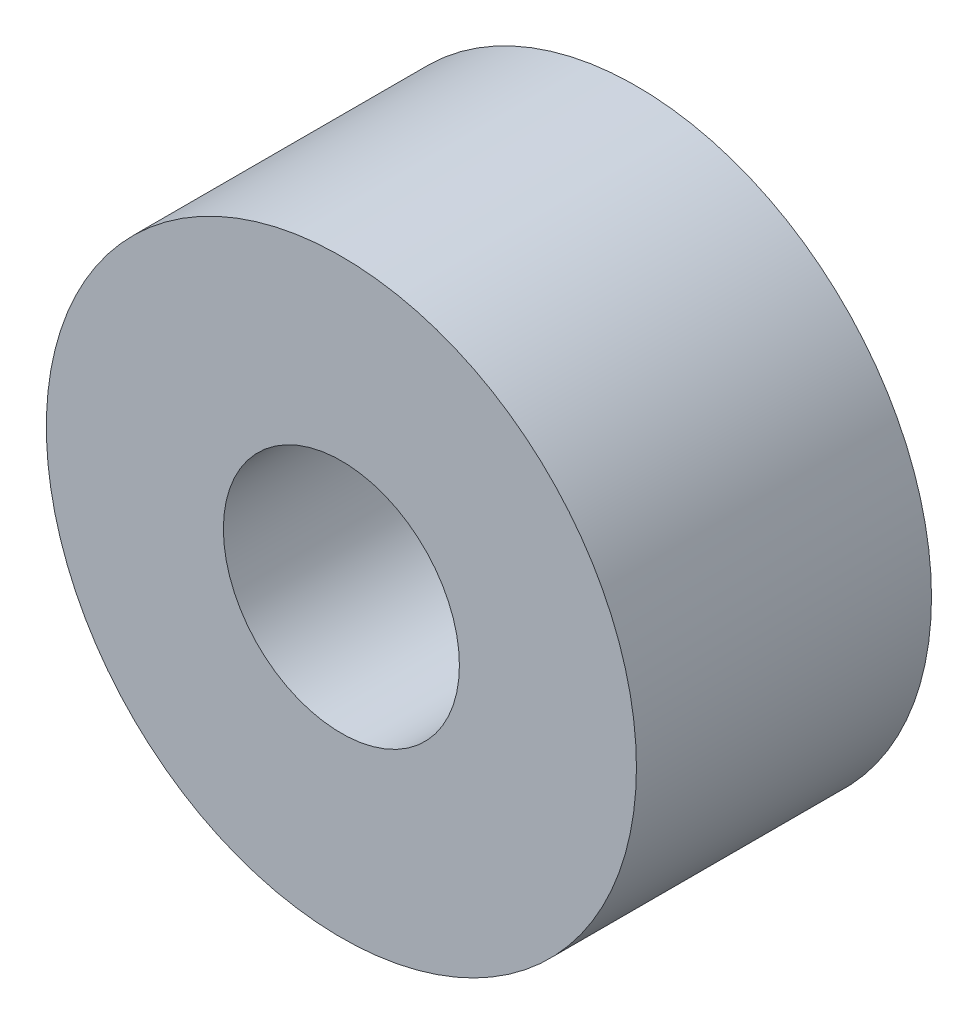
ISO-10303-21;
HEADER;
FILE_DESCRIPTION(('STEP AP214'),'2;1');
FILE_NAME('part.step','',(''),(''),'','','');
FILE_SCHEMA(('AUTOMOTIVE_DESIGN { 1 0 10303 214 1 1 1 1 }'));
ENDSEC;
DATA;
#1=APPLICATION_CONTEXT('core data for automotive mechanical design processes');
#2=APPLICATION_PROTOCOL_DEFINITION('international standard','automotive_design',2000,#1);
#3=PRODUCT_CONTEXT('',#1,'mechanical');
#4=PRODUCT('Part','Part','',(#3));
#5=PRODUCT_RELATED_PRODUCT_CATEGORY('part','',(#4));
#6=PRODUCT_DEFINITION_FORMATION('','',#4);
#7=PRODUCT_DEFINITION_CONTEXT('part definition',#1,'design');
#8=PRODUCT_DEFINITION('design','',#6,#7);
#9=PRODUCT_DEFINITION_SHAPE('','',#8);
#10=(LENGTH_UNIT() NAMED_UNIT(*) SI_UNIT(.MILLI.,.METRE.));
#11=(NAMED_UNIT(*) PLANE_ANGLE_UNIT() SI_UNIT($,.RADIAN.));
#12=(NAMED_UNIT(*) SI_UNIT($,.STERADIAN.) SOLID_ANGLE_UNIT());
#13=UNCERTAINTY_MEASURE_WITH_UNIT(LENGTH_MEASURE(1.E-05),#10,'distance_accuracy_value','');
#14=(GEOMETRIC_REPRESENTATION_CONTEXT(3) GLOBAL_UNCERTAINTY_ASSIGNED_CONTEXT((#13)) GLOBAL_UNIT_ASSIGNED_CONTEXT((#10,
#11,#12)) REPRESENTATION_CONTEXT('',''));
#15=CARTESIAN_POINT('',(0.,0.,0.));
#16=DIRECTION('',(0.,0.,1.));
#17=DIRECTION('',(1.,0.,0.));
#18=AXIS2_PLACEMENT_3D('',#15,#16,#17);
#19=CARTESIAN_POINT('',(0.,0.,2.5));
#20=DIRECTION('',(0.,0.,1.));
#21=DIRECTION('',(1.,0.,0.));
#22=AXIS2_PLACEMENT_3D('',#19,#20,#21);
#23=PLANE('',#22);
#24=CARTESIAN_POINT('',(0.,0.,2.5));
#25=DIRECTION('',(0.,0.,1.));
#26=DIRECTION('',(1.,0.,0.));
#27=AXIS2_PLACEMENT_3D('',#24,#25,#26);
#28=CIRCLE('',#27,2.5);
#29=CARTESIAN_POINT('',(2.5,0.,2.5));
#30=VERTEX_POINT('',#29);
#31=EDGE_CURVE('E10',#30,#30,#28,.T.);
#32=ORIENTED_EDGE('',*,*,#31,.T.);
#33=EDGE_LOOP('',(#32));
#34=FACE_BOUND('',#33,.T.);
#35=CARTESIAN_POINT('',(0.,0.,2.5));
#36=DIRECTION('',(0.,0.,1.));
#37=DIRECTION('',(1.,0.,0.));
#38=AXIS2_PLACEMENT_3D('',#35,#36,#37);
#39=CIRCLE('',#38,1.);
#40=CARTESIAN_POINT('',(1.,0.,2.5));
#41=VERTEX_POINT('',#40);
#42=EDGE_CURVE('E45',#41,#41,#39,.T.);
#43=ORIENTED_EDGE('',*,*,#42,.F.);
#44=EDGE_LOOP('',(#43));
#45=FACE_BOUND('',#44,.T.);
#46=ADVANCED_FACE('F34',(#34,#45),#23,.T.);
#47=CARTESIAN_POINT('',(0.,0.,0.));
#48=DIRECTION('',(0.,0.,1.));
#49=DIRECTION('',(1.,0.,0.));
#50=AXIS2_PLACEMENT_3D('',#47,#48,#49);
#51=PLANE('',#50);
#52=CARTESIAN_POINT('',(0.,0.,0.));
#53=DIRECTION('',(0.,0.,1.));
#54=DIRECTION('',(1.,0.,0.));
#55=AXIS2_PLACEMENT_3D('',#52,#53,#54);
#56=CIRCLE('',#55,2.5);
#57=CARTESIAN_POINT('',(2.5,0.,0.));
#58=VERTEX_POINT('',#57);
#59=EDGE_CURVE('E38',#58,#58,#56,.T.);
#60=ORIENTED_EDGE('',*,*,#59,.F.);
#61=EDGE_LOOP('',(#60));
#62=FACE_BOUND('',#61,.T.);
#63=CARTESIAN_POINT('',(0.,0.,0.));
#64=DIRECTION('',(0.,0.,1.));
#65=DIRECTION('',(1.,0.,0.));
#66=AXIS2_PLACEMENT_3D('',#63,#64,#65);
#67=CIRCLE('',#66,1.);
#68=CARTESIAN_POINT('',(1.,0.,0.));
#69=VERTEX_POINT('',#68);
#70=EDGE_CURVE('E47',#69,#69,#67,.T.);
#71=ORIENTED_EDGE('',*,*,#70,.T.);
#72=EDGE_LOOP('',(#71));
#73=FACE_BOUND('',#72,.T.);
#74=ADVANCED_FACE('F57',(#62,#73),#51,.F.);
#75=CARTESIAN_POINT('',(0.,0.,2.5));
#76=DIRECTION('',(0.,0.,-1.));
#77=DIRECTION('',(-1.,0.,0.));
#78=AXIS2_PLACEMENT_3D('',#75,#76,#77);
#79=CYLINDRICAL_SURFACE('',#78,2.5);
#80=ORIENTED_EDGE('',*,*,#31,.F.);
#81=EDGE_LOOP('',(#80));
#82=FACE_BOUND('',#81,.T.);
#83=ORIENTED_EDGE('',*,*,#59,.T.);
#84=EDGE_LOOP('',(#83));
#85=FACE_BOUND('',#84,.T.);
#86=ADVANCED_FACE('F36',(#82,#85),#79,.T.);
#87=CARTESIAN_POINT('',(0.,0.,2.5));
#88=DIRECTION('',(0.,0.,-1.));
#89=DIRECTION('',(-1.,0.,0.));
#90=AXIS2_PLACEMENT_3D('',#87,#88,#89);
#91=CYLINDRICAL_SURFACE('',#90,1.);
#92=ORIENTED_EDGE('',*,*,#42,.T.);
#93=EDGE_LOOP('',(#92));
#94=FACE_BOUND('',#93,.T.);
#95=ORIENTED_EDGE('',*,*,#70,.F.);
#96=EDGE_LOOP('',(#95));
#97=FACE_BOUND('',#96,.T.);
#98=ADVANCED_FACE('F53',(#94,#97),#91,.F.);
#99=CLOSED_SHELL('',(#46,#74,#86,#98));
#100=MANIFOLD_SOLID_BREP('B2',#99);
#101=ADVANCED_BREP_SHAPE_REPRESENTATION('',(#18,#100),#14);
#102=SHAPE_DEFINITION_REPRESENTATION(#9,#101);
ENDSEC;
END-ISO-10303-21;
